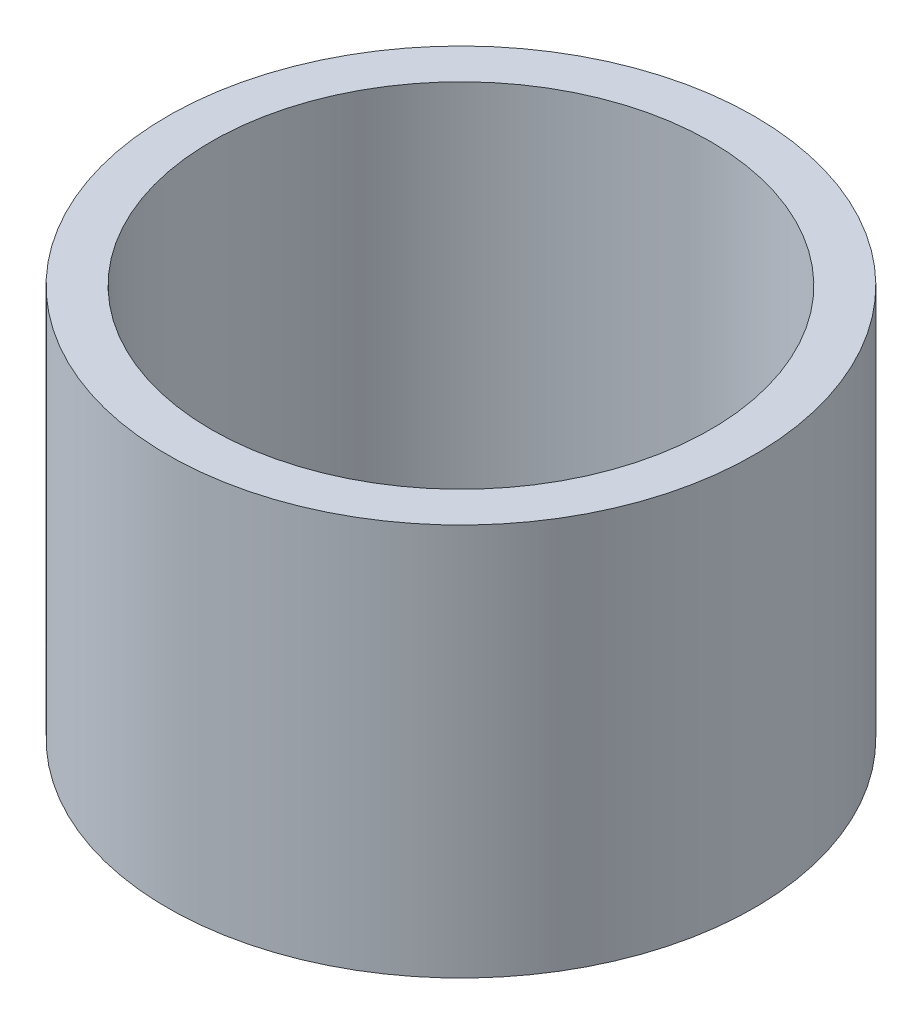
ISO-10303-21;
HEADER;
FILE_DESCRIPTION(('STEP AP214'),'2;1');
FILE_NAME('part.step','',(''),(''),'','','');
FILE_SCHEMA(('AUTOMOTIVE_DESIGN { 1 0 10303 214 1 1 1 1 }'));
ENDSEC;
DATA;
#1=APPLICATION_CONTEXT('core data for automotive mechanical design processes');
#2=APPLICATION_PROTOCOL_DEFINITION('international standard','automotive_design',2000,#1);
#3=PRODUCT_CONTEXT('',#1,'mechanical');
#4=PRODUCT('Part','Part','',(#3));
#5=PRODUCT_RELATED_PRODUCT_CATEGORY('part','',(#4));
#6=PRODUCT_DEFINITION_FORMATION('','',#4);
#7=PRODUCT_DEFINITION_CONTEXT('part definition',#1,'design');
#8=PRODUCT_DEFINITION('design','',#6,#7);
#9=PRODUCT_DEFINITION_SHAPE('','',#8);
#10=(LENGTH_UNIT() NAMED_UNIT(*) SI_UNIT(.MILLI.,.METRE.));
#11=(NAMED_UNIT(*) PLANE_ANGLE_UNIT() SI_UNIT($,.RADIAN.));
#12=(NAMED_UNIT(*) SI_UNIT($,.STERADIAN.) SOLID_ANGLE_UNIT());
#13=UNCERTAINTY_MEASURE_WITH_UNIT(LENGTH_MEASURE(1.E-05),#10,'distance_accuracy_value','');
#14=(GEOMETRIC_REPRESENTATION_CONTEXT(3) GLOBAL_UNCERTAINTY_ASSIGNED_CONTEXT((#13)) GLOBAL_UNIT_ASSIGNED_CONTEXT((#10,
#11,#12)) REPRESENTATION_CONTEXT('',''));
#15=CARTESIAN_POINT('',(0.,0.,0.));
#16=DIRECTION('',(0.,0.,1.));
#17=DIRECTION('',(1.,0.,0.));
#18=AXIS2_PLACEMENT_3D('',#15,#16,#17);
#19=CARTESIAN_POINT('',(0.,-52.0985685071575,0.));
#20=DIRECTION('',(0.,-1.,0.));
#21=DIRECTION('',(0.,0.,-1.));
#22=AXIS2_PLACEMENT_3D('',#19,#20,#21);
#23=CYLINDRICAL_SURFACE('',#22,20.75);
#24=CARTESIAN_POINT('',(0.,27.75,0.));
#25=DIRECTION('',(0.,-1.,0.));
#26=DIRECTION('',(0.,0.,-1.));
#27=AXIS2_PLACEMENT_3D('',#24,#25,#26);
#28=CIRCLE('',#27,20.75);
#29=CARTESIAN_POINT('',(0.,27.75,-20.75));
#30=VERTEX_POINT('',#29);
#31=EDGE_CURVE('E10',#30,#30,#28,.T.);
#32=ORIENTED_EDGE('',*,*,#31,.T.);
#33=EDGE_LOOP('',(#32));
#34=FACE_BOUND('',#33,.T.);
#35=CARTESIAN_POINT('',(0.,0.,0.));
#36=DIRECTION('',(0.,-1.,0.));
#37=DIRECTION('',(0.,0.,-1.));
#38=AXIS2_PLACEMENT_3D('',#35,#36,#37);
#39=CIRCLE('',#38,20.75);
#40=CARTESIAN_POINT('',(0.,0.,-20.75));
#41=VERTEX_POINT('',#40);
#42=EDGE_CURVE('E43',#41,#41,#39,.T.);
#43=ORIENTED_EDGE('',*,*,#42,.F.);
#44=EDGE_LOOP('',(#43));
#45=FACE_BOUND('',#44,.T.);
#46=ADVANCED_FACE('F29',(#34,#45),#23,.T.);
#47=CARTESIAN_POINT('',(17.65,27.75,0.));
#48=DIRECTION('',(0.,1.,0.));
#49=DIRECTION('',(0.,0.,1.));
#50=AXIS2_PLACEMENT_3D('',#47,#48,#49);
#51=PLANE('',#50);
#52=CARTESIAN_POINT('',(0.,27.75,0.));
#53=DIRECTION('',(0.,-1.,0.));
#54=DIRECTION('',(0.,0.,-1.));
#55=AXIS2_PLACEMENT_3D('',#52,#53,#54);
#56=CIRCLE('',#55,17.65);
#57=CARTESIAN_POINT('',(0.,27.75,-17.65));
#58=VERTEX_POINT('',#57);
#59=EDGE_CURVE('E35',#58,#58,#56,.T.);
#60=ORIENTED_EDGE('',*,*,#59,.T.);
#61=EDGE_LOOP('',(#60));
#62=FACE_BOUND('',#61,.T.);
#63=ORIENTED_EDGE('',*,*,#31,.F.);
#64=EDGE_LOOP('',(#63));
#65=FACE_BOUND('',#64,.T.);
#66=ADVANCED_FACE('F53',(#62,#65),#51,.T.);
#67=CARTESIAN_POINT('',(0.,-52.0985685071575,0.));
#68=DIRECTION('',(0.,-1.,0.));
#69=DIRECTION('',(0.,0.,-1.));
#70=AXIS2_PLACEMENT_3D('',#67,#68,#69);
#71=CYLINDRICAL_SURFACE('',#70,17.65);
#72=CARTESIAN_POINT('',(0.,0.,0.));
#73=DIRECTION('',(0.,-1.,0.));
#74=DIRECTION('',(0.,0.,-1.));
#75=AXIS2_PLACEMENT_3D('',#72,#73,#74);
#76=CIRCLE('',#75,17.65);
#77=CARTESIAN_POINT('',(0.,0.,-17.65));
#78=VERTEX_POINT('',#77);
#79=EDGE_CURVE('E39',#78,#78,#76,.T.);
#80=ORIENTED_EDGE('',*,*,#79,.T.);
#81=EDGE_LOOP('',(#80));
#82=FACE_BOUND('',#81,.T.);
#83=ORIENTED_EDGE('',*,*,#59,.F.);
#84=EDGE_LOOP('',(#83));
#85=FACE_BOUND('',#84,.T.);
#86=ADVANCED_FACE('F57',(#82,#85),#71,.F.);
#87=CARTESIAN_POINT('',(17.65,0.,0.));
#88=DIRECTION('',(0.,-1.,0.));
#89=DIRECTION('',(0.,0.,-1.));
#90=AXIS2_PLACEMENT_3D('',#87,#88,#89);
#91=PLANE('',#90);
#92=ORIENTED_EDGE('',*,*,#42,.T.);
#93=EDGE_LOOP('',(#92));
#94=FACE_BOUND('',#93,.T.);
#95=ORIENTED_EDGE('',*,*,#79,.F.);
#96=EDGE_LOOP('',(#95));
#97=FACE_BOUND('',#96,.T.);
#98=ADVANCED_FACE('F49',(#94,#97),#91,.T.);
#99=CLOSED_SHELL('',(#46,#66,#86,#98));
#100=MANIFOLD_SOLID_BREP('B2',#99);
#101=ADVANCED_BREP_SHAPE_REPRESENTATION('',(#18,#100),#14);
#102=SHAPE_DEFINITION_REPRESENTATION(#9,#101);
ENDSEC;
END-ISO-10303-21;
